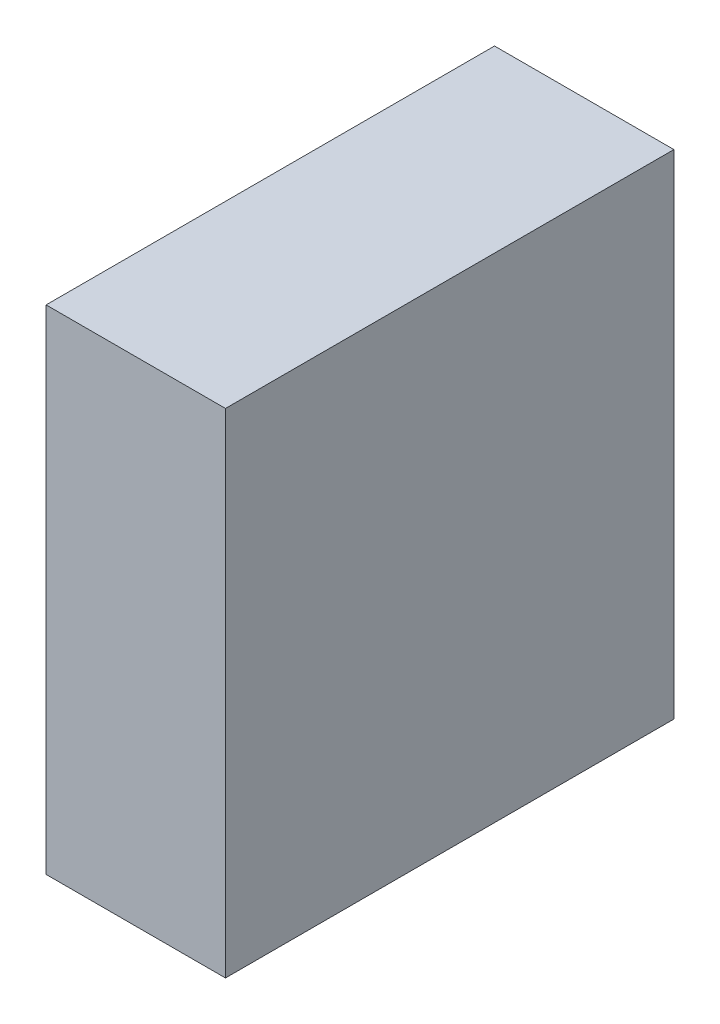
ISO-10303-21;
HEADER;
FILE_DESCRIPTION(('STEP AP214'),'2;1');
FILE_NAME('part.step','',(''),(''),'','','');
FILE_SCHEMA(('AUTOMOTIVE_DESIGN { 1 0 10303 214 1 1 1 1 }'));
ENDSEC;
DATA;
#1=APPLICATION_CONTEXT('core data for automotive mechanical design processes');
#2=APPLICATION_PROTOCOL_DEFINITION('international standard','automotive_design',2000,#1);
#3=PRODUCT_CONTEXT('',#1,'mechanical');
#4=PRODUCT('Part','Part','',(#3));
#5=PRODUCT_RELATED_PRODUCT_CATEGORY('part','',(#4));
#6=PRODUCT_DEFINITION_FORMATION('','',#4);
#7=PRODUCT_DEFINITION_CONTEXT('part definition',#1,'design');
#8=PRODUCT_DEFINITION('design','',#6,#7);
#9=PRODUCT_DEFINITION_SHAPE('','',#8);
#10=(LENGTH_UNIT() NAMED_UNIT(*) SI_UNIT(.MILLI.,.METRE.));
#11=(NAMED_UNIT(*) PLANE_ANGLE_UNIT() SI_UNIT($,.RADIAN.));
#12=(NAMED_UNIT(*) SI_UNIT($,.STERADIAN.) SOLID_ANGLE_UNIT());
#13=UNCERTAINTY_MEASURE_WITH_UNIT(LENGTH_MEASURE(1.E-05),#10,'distance_accuracy_value','');
#14=(GEOMETRIC_REPRESENTATION_CONTEXT(3) GLOBAL_UNCERTAINTY_ASSIGNED_CONTEXT((#13)) GLOBAL_UNIT_ASSIGNED_CONTEXT((#10,
#11,#12)) REPRESENTATION_CONTEXT('',''));
#15=CARTESIAN_POINT('',(0.,0.,0.));
#16=DIRECTION('',(0.,0.,1.));
#17=DIRECTION('',(1.,0.,0.));
#18=AXIS2_PLACEMENT_3D('',#15,#16,#17);
#19=CARTESIAN_POINT('',(0.,5.5,5.));
#20=DIRECTION('',(1.,0.,0.));
#21=DIRECTION('',(0.,0.,-1.));
#22=AXIS2_PLACEMENT_3D('',#19,#20,#21);
#23=PLANE('',#22);
#24=DIRECTION('',(0.,-1.,0.));
#25=VECTOR('',#24,1.);
#26=CARTESIAN_POINT('',(0.,5.5,0.));
#27=LINE('',#26,#25);
#28=CARTESIAN_POINT('',(0.,5.5,0.));
#29=VERTEX_POINT('',#28);
#30=CARTESIAN_POINT('',(0.,0.,0.));
#31=VERTEX_POINT('',#30);
#32=EDGE_CURVE('E102',#29,#31,#27,.T.);
#33=ORIENTED_EDGE('',*,*,#32,.T.);
#34=DIRECTION('',(0.,0.,-1.));
#35=VECTOR('',#34,1.);
#36=CARTESIAN_POINT('',(0.,0.,5.));
#37=LINE('',#36,#35);
#38=CARTESIAN_POINT('',(0.,0.,5.));
#39=VERTEX_POINT('',#38);
#40=EDGE_CURVE('E11',#39,#31,#37,.T.);
#41=ORIENTED_EDGE('',*,*,#40,.F.);
#42=DIRECTION('',(0.,-1.,0.));
#43=VECTOR('',#42,1.);
#44=CARTESIAN_POINT('',(0.,5.5,5.));
#45=LINE('',#44,#43);
#46=CARTESIAN_POINT('',(0.,5.5,5.));
#47=VERTEX_POINT('',#46);
#48=EDGE_CURVE('E90',#47,#39,#45,.T.);
#49=ORIENTED_EDGE('',*,*,#48,.F.);
#50=DIRECTION('',(0.,0.,-1.));
#51=VECTOR('',#50,1.);
#52=CARTESIAN_POINT('',(0.,5.5,5.));
#53=LINE('',#52,#51);
#54=EDGE_CURVE('E98',#47,#29,#53,.T.);
#55=ORIENTED_EDGE('',*,*,#54,.T.);
#56=EDGE_LOOP('',(#33,#41,#49,#55));
#57=FACE_BOUND('',#56,.T.);
#58=ADVANCED_FACE('F39',(#57),#23,.F.);
#59=CARTESIAN_POINT('',(0.,0.,5.));
#60=DIRECTION('',(0.,1.,0.));
#61=DIRECTION('',(0.,0.,1.));
#62=AXIS2_PLACEMENT_3D('',#59,#60,#61);
#63=PLANE('',#62);
#64=DIRECTION('',(1.,0.,0.));
#65=VECTOR('',#64,1.);
#66=CARTESIAN_POINT('',(0.,0.,0.));
#67=LINE('',#66,#65);
#68=CARTESIAN_POINT('',(2.,0.,0.));
#69=VERTEX_POINT('',#68);
#70=EDGE_CURVE('E94',#31,#69,#67,.T.);
#71=ORIENTED_EDGE('',*,*,#70,.T.);
#72=DIRECTION('',(0.,0.,-1.));
#73=VECTOR('',#72,1.);
#74=CARTESIAN_POINT('',(2.,0.,5.));
#75=LINE('',#74,#73);
#76=CARTESIAN_POINT('',(2.,0.,5.));
#77=VERTEX_POINT('',#76);
#78=EDGE_CURVE('E47',#77,#69,#75,.T.);
#79=ORIENTED_EDGE('',*,*,#78,.F.);
#80=DIRECTION('',(1.,0.,0.));
#81=VECTOR('',#80,1.);
#82=CARTESIAN_POINT('',(0.,0.,5.));
#83=LINE('',#82,#81);
#84=EDGE_CURVE('E85',#39,#77,#83,.T.);
#85=ORIENTED_EDGE('',*,*,#84,.F.);
#86=ORIENTED_EDGE('',*,*,#40,.T.);
#87=EDGE_LOOP('',(#71,#79,#85,#86));
#88=FACE_BOUND('',#87,.T.);
#89=ADVANCED_FACE('F93',(#88),#63,.F.);
#90=CARTESIAN_POINT('',(2.,0.,5.));
#91=DIRECTION('',(-1.,0.,0.));
#92=DIRECTION('',(0.,0.,1.));
#93=AXIS2_PLACEMENT_3D('',#90,#91,#92);
#94=PLANE('',#93);
#95=DIRECTION('',(0.,1.,0.));
#96=VECTOR('',#95,1.);
#97=CARTESIAN_POINT('',(2.,0.,0.));
#98=LINE('',#97,#96);
#99=CARTESIAN_POINT('',(2.,5.5,0.));
#100=VERTEX_POINT('',#99);
#101=EDGE_CURVE('E72',#69,#100,#98,.T.);
#102=ORIENTED_EDGE('',*,*,#101,.T.);
#103=DIRECTION('',(0.,0.,-1.));
#104=VECTOR('',#103,1.);
#105=CARTESIAN_POINT('',(2.,5.5,5.));
#106=LINE('',#105,#104);
#107=CARTESIAN_POINT('',(2.,5.5,5.));
#108=VERTEX_POINT('',#107);
#109=EDGE_CURVE('E95',#108,#100,#106,.T.);
#110=ORIENTED_EDGE('',*,*,#109,.F.);
#111=DIRECTION('',(0.,1.,0.));
#112=VECTOR('',#111,1.);
#113=CARTESIAN_POINT('',(2.,0.,5.));
#114=LINE('',#113,#112);
#115=EDGE_CURVE('E88',#77,#108,#114,.T.);
#116=ORIENTED_EDGE('',*,*,#115,.F.);
#117=ORIENTED_EDGE('',*,*,#78,.T.);
#118=EDGE_LOOP('',(#102,#110,#116,#117));
#119=FACE_BOUND('',#118,.T.);
#120=ADVANCED_FACE('F96',(#119),#94,.F.);
#121=CARTESIAN_POINT('',(2.,5.5,5.));
#122=DIRECTION('',(0.,-1.,0.));
#123=DIRECTION('',(0.,0.,-1.));
#124=AXIS2_PLACEMENT_3D('',#121,#122,#123);
#125=PLANE('',#124);
#126=DIRECTION('',(-1.,0.,0.));
#127=VECTOR('',#126,1.);
#128=CARTESIAN_POINT('',(2.,5.5,0.));
#129=LINE('',#128,#127);
#130=EDGE_CURVE('E78',#100,#29,#129,.T.);
#131=ORIENTED_EDGE('',*,*,#130,.T.);
#132=ORIENTED_EDGE('',*,*,#54,.F.);
#133=DIRECTION('',(-1.,0.,0.));
#134=VECTOR('',#133,1.);
#135=CARTESIAN_POINT('',(2.,5.5,5.));
#136=LINE('',#135,#134);
#137=EDGE_CURVE('E55',#108,#47,#136,.T.);
#138=ORIENTED_EDGE('',*,*,#137,.F.);
#139=ORIENTED_EDGE('',*,*,#109,.T.);
#140=EDGE_LOOP('',(#131,#132,#138,#139));
#141=FACE_BOUND('',#140,.T.);
#142=ADVANCED_FACE('F109',(#141),#125,.F.);
#143=CARTESIAN_POINT('',(0.,0.,5.));
#144=DIRECTION('',(0.,0.,1.));
#145=DIRECTION('',(1.,0.,0.));
#146=AXIS2_PLACEMENT_3D('',#143,#144,#145);
#147=PLANE('',#146);
#148=ORIENTED_EDGE('',*,*,#48,.T.);
#149=ORIENTED_EDGE('',*,*,#84,.T.);
#150=ORIENTED_EDGE('',*,*,#115,.T.);
#151=ORIENTED_EDGE('',*,*,#137,.T.);
#152=EDGE_LOOP('',(#148,#149,#150,#151));
#153=FACE_BOUND('',#152,.T.);
#154=ADVANCED_FACE('F86',(#153),#147,.T.);
#155=CARTESIAN_POINT('',(0.,0.,0.));
#156=DIRECTION('',(0.,0.,1.));
#157=DIRECTION('',(1.,0.,0.));
#158=AXIS2_PLACEMENT_3D('',#155,#156,#157);
#159=PLANE('',#158);
#160=ORIENTED_EDGE('',*,*,#32,.F.);
#161=ORIENTED_EDGE('',*,*,#130,.F.);
#162=ORIENTED_EDGE('',*,*,#101,.F.);
#163=ORIENTED_EDGE('',*,*,#70,.F.);
#164=EDGE_LOOP('',(#160,#161,#162,#163));
#165=FACE_BOUND('',#164,.T.);
#166=ADVANCED_FACE('F112',(#165),#159,.F.);
#167=CLOSED_SHELL('',(#58,#89,#120,#142,#154,#166));
#168=MANIFOLD_SOLID_BREP('B2',#167);
#169=ADVANCED_BREP_SHAPE_REPRESENTATION('',(#18,#168),#14);
#170=SHAPE_DEFINITION_REPRESENTATION(#9,#169);
ENDSEC;
END-ISO-10303-21;
